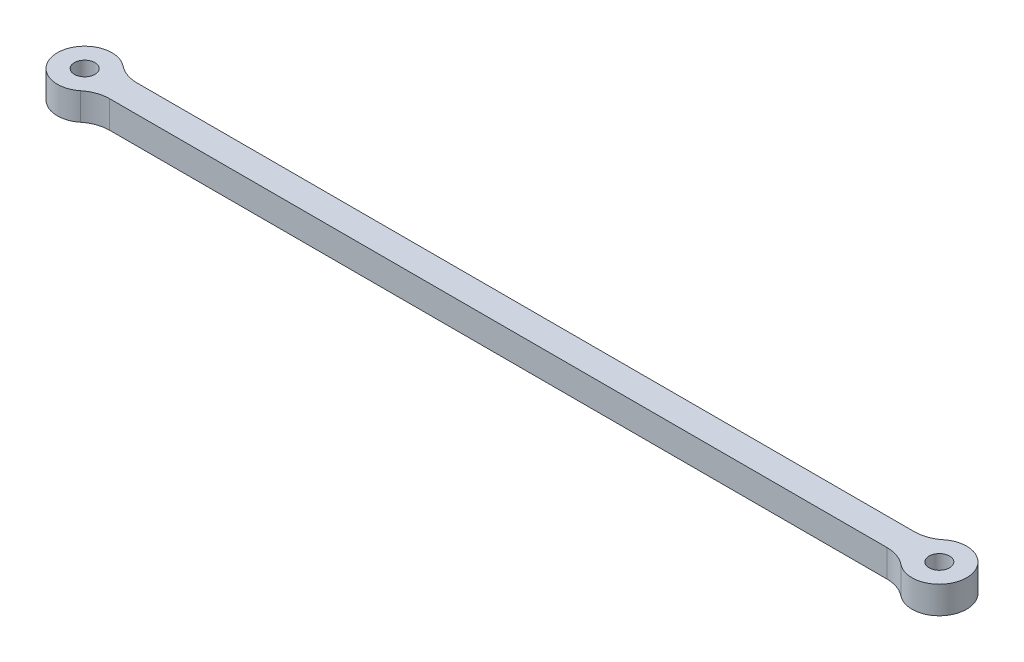
ISO-10303-21;
HEADER;
FILE_DESCRIPTION(('STEP AP214'),'2;1');
FILE_NAME('part.step','',(''),(''),'','','');
FILE_SCHEMA(('AUTOMOTIVE_DESIGN { 1 0 10303 214 1 1 1 1 }'));
ENDSEC;
DATA;
#1=APPLICATION_CONTEXT('core data for automotive mechanical design processes');
#2=APPLICATION_PROTOCOL_DEFINITION('international standard','automotive_design',2000,#1);
#3=PRODUCT_CONTEXT('',#1,'mechanical');
#4=PRODUCT('Part','Part','',(#3));
#5=PRODUCT_RELATED_PRODUCT_CATEGORY('part','',(#4));
#6=PRODUCT_DEFINITION_FORMATION('','',#4);
#7=PRODUCT_DEFINITION_CONTEXT('part definition',#1,'design');
#8=PRODUCT_DEFINITION('design','',#6,#7);
#9=PRODUCT_DEFINITION_SHAPE('','',#8);
#10=(LENGTH_UNIT() NAMED_UNIT(*) SI_UNIT(.MILLI.,.METRE.));
#11=(NAMED_UNIT(*) PLANE_ANGLE_UNIT() SI_UNIT($,.RADIAN.));
#12=(NAMED_UNIT(*) SI_UNIT($,.STERADIAN.) SOLID_ANGLE_UNIT());
#13=UNCERTAINTY_MEASURE_WITH_UNIT(LENGTH_MEASURE(1.E-05),#10,'distance_accuracy_value','');
#14=(GEOMETRIC_REPRESENTATION_CONTEXT(3) GLOBAL_UNCERTAINTY_ASSIGNED_CONTEXT((#13)) GLOBAL_UNIT_ASSIGNED_CONTEXT((#10,
#11,#12)) REPRESENTATION_CONTEXT('',''));
#15=CARTESIAN_POINT('',(0.,0.,0.));
#16=DIRECTION('',(0.,0.,1.));
#17=DIRECTION('',(1.,0.,0.));
#18=AXIS2_PLACEMENT_3D('',#15,#16,#17);
#19=CARTESIAN_POINT('',(250.,8.,0.));
#20=DIRECTION('',(0.,1.,0.));
#21=DIRECTION('',(0.,0.,1.));
#22=AXIS2_PLACEMENT_3D('',#19,#20,#21);
#23=PLANE('',#22);
#24=CARTESIAN_POINT('',(0.,8.,0.));
#25=DIRECTION('',(0.,1.,0.));
#26=DIRECTION('',(0.,0.,1.));
#27=AXIS2_PLACEMENT_3D('',#24,#25,#26);
#28=CIRCLE('',#27,3.);
#29=CARTESIAN_POINT('',(0.,8.,3.));
#30=VERTEX_POINT('',#29);
#31=EDGE_CURVE('E132',#30,#30,#28,.T.);
#32=ORIENTED_EDGE('',*,*,#31,.F.);
#33=EDGE_LOOP('',(#32));
#34=FACE_BOUND('',#33,.T.);
#35=DIRECTION('',(1.,0.,0.));
#36=VECTOR('',#35,1.);
#37=CARTESIAN_POINT('',(6.92820323027551,8.,4.));
#38=LINE('',#37,#36);
#39=CARTESIAN_POINT('',(11.3137084989848,8.,4.));
#40=VERTEX_POINT('',#39);
#41=CARTESIAN_POINT('',(238.686291501015,8.,4.));
#42=VERTEX_POINT('',#41);
#43=EDGE_CURVE('E141',#40,#42,#38,.T.);
#44=ORIENTED_EDGE('',*,*,#43,.T.);
#45=CARTESIAN_POINT('',(238.686291501015,8.,14.));
#46=DIRECTION('',(0.,1.,0.));
#47=DIRECTION('',(0.,0.,1.));
#48=AXIS2_PLACEMENT_3D('',#45,#46,#47);
#49=CIRCLE('',#48,10.);
#50=CARTESIAN_POINT('',(244.971685111562,8.,6.22222222222222));
#51=VERTEX_POINT('',#50);
#52=EDGE_CURVE('E113',#42,#51,#49,.F.);
#53=ORIENTED_EDGE('',*,*,#52,.T.);
#54=CARTESIAN_POINT('',(250.,8.,0.));
#55=DIRECTION('',(0.,1.,0.));
#56=DIRECTION('',(0.,0.,1.));
#57=AXIS2_PLACEMENT_3D('',#54,#55,#56);
#58=CIRCLE('',#57,8.00000000000001);
#59=CARTESIAN_POINT('',(244.971685111562,8.,-6.22222222222222));
#60=VERTEX_POINT('',#59);
#61=EDGE_CURVE('E123',#51,#60,#58,.T.);
#62=ORIENTED_EDGE('',*,*,#61,.T.);
#63=CARTESIAN_POINT('',(238.686291501015,8.,-14.));
#64=DIRECTION('',(0.,1.,0.));
#65=DIRECTION('',(0.,0.,1.));
#66=AXIS2_PLACEMENT_3D('',#63,#64,#65);
#67=CIRCLE('',#66,10.);
#68=CARTESIAN_POINT('',(238.686291501015,8.,-4.));
#69=VERTEX_POINT('',#68);
#70=EDGE_CURVE('E161',#60,#69,#67,.F.);
#71=ORIENTED_EDGE('',*,*,#70,.T.);
#72=DIRECTION('',(-1.,0.,0.));
#73=VECTOR('',#72,1.);
#74=CARTESIAN_POINT('',(6.92820323027551,8.,-4.));
#75=LINE('',#74,#73);
#76=CARTESIAN_POINT('',(11.3137084989848,8.,-4.));
#77=VERTEX_POINT('',#76);
#78=EDGE_CURVE('E177',#69,#77,#75,.T.);
#79=ORIENTED_EDGE('',*,*,#78,.T.);
#80=CARTESIAN_POINT('',(11.3137084989848,8.,-14.));
#81=DIRECTION('',(0.,1.,0.));
#82=DIRECTION('',(0.,0.,1.));
#83=AXIS2_PLACEMENT_3D('',#80,#81,#82);
#84=CIRCLE('',#83,10.);
#85=CARTESIAN_POINT('',(5.02831488843767,8.,-6.22222222222222));
#86=VERTEX_POINT('',#85);
#87=EDGE_CURVE('E59',#77,#86,#84,.F.);
#88=ORIENTED_EDGE('',*,*,#87,.T.);
#89=CARTESIAN_POINT('',(0.,8.,0.));
#90=DIRECTION('',(0.,1.,0.));
#91=DIRECTION('',(0.,0.,1.));
#92=AXIS2_PLACEMENT_3D('',#89,#90,#91);
#93=CIRCLE('',#92,8.);
#94=CARTESIAN_POINT('',(5.02831488843767,8.,6.22222222222222));
#95=VERTEX_POINT('',#94);
#96=EDGE_CURVE('E174',#86,#95,#93,.T.);
#97=ORIENTED_EDGE('',*,*,#96,.T.);
#98=CARTESIAN_POINT('',(11.3137084989848,8.,14.));
#99=DIRECTION('',(0.,1.,0.));
#100=DIRECTION('',(0.,0.,1.));
#101=AXIS2_PLACEMENT_3D('',#98,#99,#100);
#102=CIRCLE('',#101,10.);
#103=EDGE_CURVE('E11',#95,#40,#102,.F.);
#104=ORIENTED_EDGE('',*,*,#103,.T.);
#105=EDGE_LOOP('',(#44,#53,#62,#71,#79,#88,#97,#104));
#106=FACE_BOUND('',#105,.T.);
#107=CARTESIAN_POINT('',(250.,8.,0.));
#108=DIRECTION('',(0.,1.,0.));
#109=DIRECTION('',(0.,0.,1.));
#110=AXIS2_PLACEMENT_3D('',#107,#108,#109);
#111=CIRCLE('',#110,2.99999999999999);
#112=CARTESIAN_POINT('',(250.,8.,2.99999999999999));
#113=VERTEX_POINT('',#112);
#114=EDGE_CURVE('E182',#113,#113,#111,.T.);
#115=ORIENTED_EDGE('',*,*,#114,.F.);
#116=EDGE_LOOP('',(#115));
#117=FACE_BOUND('',#116,.T.);
#118=ADVANCED_FACE('F37',(#34,#106,#117),#23,.T.);
#119=CARTESIAN_POINT('',(250.,0.,0.));
#120=DIRECTION('',(0.,1.,0.));
#121=DIRECTION('',(0.,0.,1.));
#122=AXIS2_PLACEMENT_3D('',#119,#120,#121);
#123=PLANE('',#122);
#124=CARTESIAN_POINT('',(250.,0.,0.));
#125=DIRECTION('',(0.,1.,0.));
#126=DIRECTION('',(0.,0.,1.));
#127=AXIS2_PLACEMENT_3D('',#124,#125,#126);
#128=CIRCLE('',#127,8.00000000000001);
#129=CARTESIAN_POINT('',(244.971685111562,0.,6.22222222222222));
#130=VERTEX_POINT('',#129);
#131=CARTESIAN_POINT('',(244.971685111562,0.,-6.22222222222222));
#132=VERTEX_POINT('',#131);
#133=EDGE_CURVE('E120',#130,#132,#128,.T.);
#134=ORIENTED_EDGE('',*,*,#133,.F.);
#135=CARTESIAN_POINT('',(238.686291501015,0.,14.));
#136=DIRECTION('',(0.,1.,0.));
#137=DIRECTION('',(0.,0.,1.));
#138=AXIS2_PLACEMENT_3D('',#135,#136,#137);
#139=CIRCLE('',#138,10.);
#140=CARTESIAN_POINT('',(238.686291501015,0.,4.));
#141=VERTEX_POINT('',#140);
#142=EDGE_CURVE('E103',#130,#141,#139,.T.);
#143=ORIENTED_EDGE('',*,*,#142,.T.);
#144=DIRECTION('',(1.,0.,0.));
#145=VECTOR('',#144,1.);
#146=CARTESIAN_POINT('',(6.92820323027551,0.,4.));
#147=LINE('',#146,#145);
#148=CARTESIAN_POINT('',(11.3137084989848,0.,4.));
#149=VERTEX_POINT('',#148);
#150=EDGE_CURVE('E145',#149,#141,#147,.T.);
#151=ORIENTED_EDGE('',*,*,#150,.F.);
#152=CARTESIAN_POINT('',(11.3137084989848,0.,14.));
#153=DIRECTION('',(0.,1.,0.));
#154=DIRECTION('',(0.,0.,1.));
#155=AXIS2_PLACEMENT_3D('',#152,#153,#154);
#156=CIRCLE('',#155,10.);
#157=CARTESIAN_POINT('',(5.02831488843767,0.,6.22222222222222));
#158=VERTEX_POINT('',#157);
#159=EDGE_CURVE('E45',#149,#158,#156,.T.);
#160=ORIENTED_EDGE('',*,*,#159,.T.);
#161=CARTESIAN_POINT('',(0.,0.,0.));
#162=DIRECTION('',(0.,1.,0.));
#163=DIRECTION('',(0.,0.,1.));
#164=AXIS2_PLACEMENT_3D('',#161,#162,#163);
#165=CIRCLE('',#164,8.);
#166=CARTESIAN_POINT('',(5.02831488843767,0.,-6.22222222222222));
#167=VERTEX_POINT('',#166);
#168=EDGE_CURVE('E135',#167,#158,#165,.T.);
#169=ORIENTED_EDGE('',*,*,#168,.F.);
#170=CARTESIAN_POINT('',(11.3137084989848,0.,-14.));
#171=DIRECTION('',(0.,1.,0.));
#172=DIRECTION('',(0.,0.,1.));
#173=AXIS2_PLACEMENT_3D('',#170,#171,#172);
#174=CIRCLE('',#173,10.);
#175=CARTESIAN_POINT('',(11.3137084989848,0.,-4.));
#176=VERTEX_POINT('',#175);
#177=EDGE_CURVE('E163',#167,#176,#174,.T.);
#178=ORIENTED_EDGE('',*,*,#177,.T.);
#179=DIRECTION('',(-1.,0.,0.));
#180=VECTOR('',#179,1.);
#181=CARTESIAN_POINT('',(6.92820323027551,0.,-4.));
#182=LINE('',#181,#180);
#183=CARTESIAN_POINT('',(238.686291501015,0.,-4.));
#184=VERTEX_POINT('',#183);
#185=EDGE_CURVE('E131',#184,#176,#182,.T.);
#186=ORIENTED_EDGE('',*,*,#185,.F.);
#187=CARTESIAN_POINT('',(238.686291501015,0.,-14.));
#188=DIRECTION('',(0.,1.,0.));
#189=DIRECTION('',(0.,0.,1.));
#190=AXIS2_PLACEMENT_3D('',#187,#188,#189);
#191=CIRCLE('',#190,10.);
#192=EDGE_CURVE('E130',#184,#132,#191,.T.);
#193=ORIENTED_EDGE('',*,*,#192,.T.);
#194=EDGE_LOOP('',(#134,#143,#151,#160,#169,#178,#186,#193));
#195=FACE_BOUND('',#194,.T.);
#196=CARTESIAN_POINT('',(0.,0.,0.));
#197=DIRECTION('',(0.,1.,0.));
#198=DIRECTION('',(0.,0.,1.));
#199=AXIS2_PLACEMENT_3D('',#196,#197,#198);
#200=CIRCLE('',#199,3.);
#201=CARTESIAN_POINT('',(0.,0.,3.));
#202=VERTEX_POINT('',#201);
#203=EDGE_CURVE('E138',#202,#202,#200,.T.);
#204=ORIENTED_EDGE('',*,*,#203,.T.);
#205=EDGE_LOOP('',(#204));
#206=FACE_BOUND('',#205,.T.);
#207=CARTESIAN_POINT('',(250.,0.,0.));
#208=DIRECTION('',(0.,1.,0.));
#209=DIRECTION('',(0.,0.,1.));
#210=AXIS2_PLACEMENT_3D('',#207,#208,#209);
#211=CIRCLE('',#210,2.99999999999999);
#212=CARTESIAN_POINT('',(250.,0.,2.99999999999999));
#213=VERTEX_POINT('',#212);
#214=EDGE_CURVE('E184',#213,#213,#211,.T.);
#215=ORIENTED_EDGE('',*,*,#214,.T.);
#216=EDGE_LOOP('',(#215));
#217=FACE_BOUND('',#216,.T.);
#218=ADVANCED_FACE('F127',(#195,#206,#217),#123,.F.);
#219=CARTESIAN_POINT('',(250.,8.,0.));
#220=DIRECTION('',(0.,-1.,0.));
#221=DIRECTION('',(0.,0.,-1.));
#222=AXIS2_PLACEMENT_3D('',#219,#220,#221);
#223=CYLINDRICAL_SURFACE('',#222,8.00000000000001);
#224=ORIENTED_EDGE('',*,*,#61,.F.);
#225=DIRECTION('',(0.,-1.,0.));
#226=VECTOR('',#225,1.);
#227=CARTESIAN_POINT('',(244.971685111562,8.,6.22222222222222));
#228=LINE('',#227,#226);
#229=EDGE_CURVE('E107',#51,#130,#228,.T.);
#230=ORIENTED_EDGE('',*,*,#229,.T.);
#231=ORIENTED_EDGE('',*,*,#133,.T.);
#232=DIRECTION('',(0.,-1.,0.));
#233=VECTOR('',#232,1.);
#234=CARTESIAN_POINT('',(244.971685111562,8.,-6.22222222222222));
#235=LINE('',#234,#233);
#236=EDGE_CURVE('E125',#132,#60,#235,.F.);
#237=ORIENTED_EDGE('',*,*,#236,.T.);
#238=EDGE_LOOP('',(#224,#230,#231,#237));
#239=FACE_BOUND('',#238,.T.);
#240=ADVANCED_FACE('F119',(#239),#223,.T.);
#241=CARTESIAN_POINT('',(6.92820323027551,8.,-4.));
#242=DIRECTION('',(0.,0.,1.));
#243=DIRECTION('',(1.,0.,0.));
#244=AXIS2_PLACEMENT_3D('',#241,#242,#243);
#245=PLANE('',#244);
#246=ORIENTED_EDGE('',*,*,#78,.F.);
#247=DIRECTION('',(0.,1.,0.));
#248=VECTOR('',#247,1.);
#249=CARTESIAN_POINT('',(238.686291501015,0.,-4.));
#250=LINE('',#249,#248);
#251=EDGE_CURVE('E153',#69,#184,#250,.F.);
#252=ORIENTED_EDGE('',*,*,#251,.T.);
#253=ORIENTED_EDGE('',*,*,#185,.T.);
#254=DIRECTION('',(0.,1.,0.));
#255=VECTOR('',#254,1.);
#256=CARTESIAN_POINT('',(11.3137084989848,8.,-4.));
#257=LINE('',#256,#255);
#258=EDGE_CURVE('E151',#176,#77,#257,.T.);
#259=ORIENTED_EDGE('',*,*,#258,.T.);
#260=EDGE_LOOP('',(#246,#252,#253,#259));
#261=FACE_BOUND('',#260,.T.);
#262=ADVANCED_FACE('F208',(#261),#245,.F.);
#263=CARTESIAN_POINT('',(0.,8.,0.));
#264=DIRECTION('',(0.,-1.,0.));
#265=DIRECTION('',(0.,0.,-1.));
#266=AXIS2_PLACEMENT_3D('',#263,#264,#265);
#267=CYLINDRICAL_SURFACE('',#266,8.);
#268=ORIENTED_EDGE('',*,*,#96,.F.);
#269=DIRECTION('',(0.,-1.,0.));
#270=VECTOR('',#269,1.);
#271=CARTESIAN_POINT('',(5.02831488843767,8.,-6.22222222222222));
#272=LINE('',#271,#270);
#273=EDGE_CURVE('E114',#86,#167,#272,.T.);
#274=ORIENTED_EDGE('',*,*,#273,.T.);
#275=ORIENTED_EDGE('',*,*,#168,.T.);
#276=DIRECTION('',(0.,-1.,0.));
#277=VECTOR('',#276,1.);
#278=CARTESIAN_POINT('',(5.02831488843767,8.,6.22222222222222));
#279=LINE('',#278,#277);
#280=EDGE_CURVE('E52',#158,#95,#279,.F.);
#281=ORIENTED_EDGE('',*,*,#280,.T.);
#282=EDGE_LOOP('',(#268,#274,#275,#281));
#283=FACE_BOUND('',#282,.T.);
#284=ADVANCED_FACE('F168',(#283),#267,.T.);
#285=CARTESIAN_POINT('',(6.92820323027551,8.,4.));
#286=DIRECTION('',(0.,0.,-1.));
#287=DIRECTION('',(-1.,0.,0.));
#288=AXIS2_PLACEMENT_3D('',#285,#286,#287);
#289=PLANE('',#288);
#290=ORIENTED_EDGE('',*,*,#150,.T.);
#291=DIRECTION('',(0.,1.,0.));
#292=VECTOR('',#291,1.);
#293=CARTESIAN_POINT('',(238.686291501015,8.,4.));
#294=LINE('',#293,#292);
#295=EDGE_CURVE('E108',#141,#42,#294,.T.);
#296=ORIENTED_EDGE('',*,*,#295,.T.);
#297=ORIENTED_EDGE('',*,*,#43,.F.);
#298=DIRECTION('',(0.,1.,0.));
#299=VECTOR('',#298,1.);
#300=CARTESIAN_POINT('',(11.3137084989848,0.,4.));
#301=LINE('',#300,#299);
#302=EDGE_CURVE('E124',#40,#149,#301,.F.);
#303=ORIENTED_EDGE('',*,*,#302,.T.);
#304=EDGE_LOOP('',(#290,#296,#297,#303));
#305=FACE_BOUND('',#304,.T.);
#306=ADVANCED_FACE('F176',(#305),#289,.F.);
#307=CARTESIAN_POINT('',(0.,8.,0.));
#308=DIRECTION('',(0.,-1.,0.));
#309=DIRECTION('',(0.,0.,-1.));
#310=AXIS2_PLACEMENT_3D('',#307,#308,#309);
#311=CYLINDRICAL_SURFACE('',#310,3.);
#312=ORIENTED_EDGE('',*,*,#31,.T.);
#313=EDGE_LOOP('',(#312));
#314=FACE_BOUND('',#313,.T.);
#315=ORIENTED_EDGE('',*,*,#203,.F.);
#316=EDGE_LOOP('',(#315));
#317=FACE_BOUND('',#316,.T.);
#318=ADVANCED_FACE('F201',(#314,#317),#311,.F.);
#319=CARTESIAN_POINT('',(250.,8.,0.));
#320=DIRECTION('',(0.,-1.,0.));
#321=DIRECTION('',(0.,0.,-1.));
#322=AXIS2_PLACEMENT_3D('',#319,#320,#321);
#323=CYLINDRICAL_SURFACE('',#322,2.99999999999999);
#324=ORIENTED_EDGE('',*,*,#114,.T.);
#325=EDGE_LOOP('',(#324));
#326=FACE_BOUND('',#325,.T.);
#327=ORIENTED_EDGE('',*,*,#214,.F.);
#328=EDGE_LOOP('',(#327));
#329=FACE_BOUND('',#328,.T.);
#330=ADVANCED_FACE('F190',(#326,#329),#323,.F.);
#331=CARTESIAN_POINT('',(238.686291501015,8.,14.));
#332=DIRECTION('',(0.,-1.,0.));
#333=DIRECTION('',(0.,0.,-1.));
#334=AXIS2_PLACEMENT_3D('',#331,#332,#333);
#335=CYLINDRICAL_SURFACE('',#334,10.);
#336=ORIENTED_EDGE('',*,*,#52,.F.);
#337=ORIENTED_EDGE('',*,*,#295,.F.);
#338=ORIENTED_EDGE('',*,*,#142,.F.);
#339=ORIENTED_EDGE('',*,*,#229,.F.);
#340=EDGE_LOOP('',(#336,#337,#338,#339));
#341=FACE_BOUND('',#340,.T.);
#342=ADVANCED_FACE('F106',(#341),#335,.F.);
#343=CARTESIAN_POINT('',(238.686291501015,8.,-14.));
#344=DIRECTION('',(0.,-1.,0.));
#345=DIRECTION('',(0.,0.,-1.));
#346=AXIS2_PLACEMENT_3D('',#343,#344,#345);
#347=CYLINDRICAL_SURFACE('',#346,10.);
#348=ORIENTED_EDGE('',*,*,#70,.F.);
#349=ORIENTED_EDGE('',*,*,#236,.F.);
#350=ORIENTED_EDGE('',*,*,#192,.F.);
#351=ORIENTED_EDGE('',*,*,#251,.F.);
#352=EDGE_LOOP('',(#348,#349,#350,#351));
#353=FACE_BOUND('',#352,.T.);
#354=ADVANCED_FACE('F216',(#353),#347,.F.);
#355=CARTESIAN_POINT('',(11.3137084989848,8.,-14.));
#356=DIRECTION('',(0.,-1.,0.));
#357=DIRECTION('',(0.,0.,-1.));
#358=AXIS2_PLACEMENT_3D('',#355,#356,#357);
#359=CYLINDRICAL_SURFACE('',#358,10.);
#360=ORIENTED_EDGE('',*,*,#87,.F.);
#361=ORIENTED_EDGE('',*,*,#258,.F.);
#362=ORIENTED_EDGE('',*,*,#177,.F.);
#363=ORIENTED_EDGE('',*,*,#273,.F.);
#364=EDGE_LOOP('',(#360,#361,#362,#363));
#365=FACE_BOUND('',#364,.T.);
#366=ADVANCED_FACE('F218',(#365),#359,.F.);
#367=CARTESIAN_POINT('',(11.3137084989848,8.,14.));
#368=DIRECTION('',(0.,-1.,0.));
#369=DIRECTION('',(0.,0.,-1.));
#370=AXIS2_PLACEMENT_3D('',#367,#368,#369);
#371=CYLINDRICAL_SURFACE('',#370,10.);
#372=ORIENTED_EDGE('',*,*,#103,.F.);
#373=ORIENTED_EDGE('',*,*,#280,.F.);
#374=ORIENTED_EDGE('',*,*,#159,.F.);
#375=ORIENTED_EDGE('',*,*,#302,.F.);
#376=EDGE_LOOP('',(#372,#373,#374,#375));
#377=FACE_BOUND('',#376,.T.);
#378=ADVANCED_FACE('F39',(#377),#371,.F.);
#379=CLOSED_SHELL('',(#118,#218,#240,#262,#284,#306,#318,#330,#342,#354,#366,#378));
#380=MANIFOLD_SOLID_BREP('B2',#379);
#381=ADVANCED_BREP_SHAPE_REPRESENTATION('',(#18,#380),#14);
#382=SHAPE_DEFINITION_REPRESENTATION(#9,#381);
ENDSEC;
END-ISO-10303-21;
